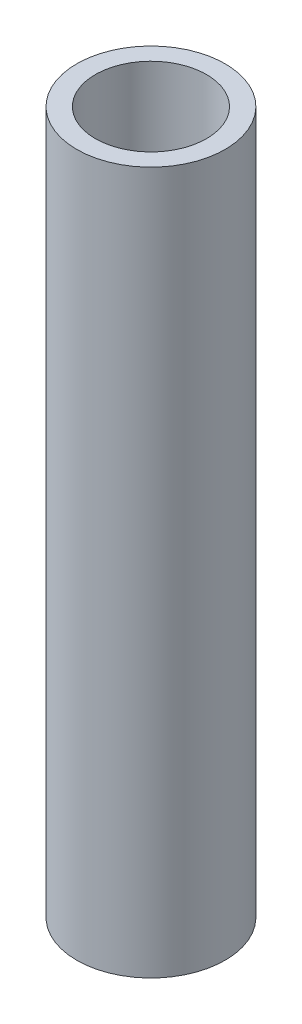
ISO-10303-21;
HEADER;
FILE_DESCRIPTION(('STEP AP214'),'2;1');
FILE_NAME('part.step','',(''),(''),'','','');
FILE_SCHEMA(('AUTOMOTIVE_DESIGN { 1 0 10303 214 1 1 1 1 }'));
ENDSEC;
DATA;
#1=APPLICATION_CONTEXT('core data for automotive mechanical design processes');
#2=APPLICATION_PROTOCOL_DEFINITION('international standard','automotive_design',2000,#1);
#3=PRODUCT_CONTEXT('',#1,'mechanical');
#4=PRODUCT('Part','Part','',(#3));
#5=PRODUCT_RELATED_PRODUCT_CATEGORY('part','',(#4));
#6=PRODUCT_DEFINITION_FORMATION('','',#4);
#7=PRODUCT_DEFINITION_CONTEXT('part definition',#1,'design');
#8=PRODUCT_DEFINITION('design','',#6,#7);
#9=PRODUCT_DEFINITION_SHAPE('','',#8);
#10=(LENGTH_UNIT() NAMED_UNIT(*) SI_UNIT(.MILLI.,.METRE.));
#11=(NAMED_UNIT(*) PLANE_ANGLE_UNIT() SI_UNIT($,.RADIAN.));
#12=(NAMED_UNIT(*) SI_UNIT($,.STERADIAN.) SOLID_ANGLE_UNIT());
#13=UNCERTAINTY_MEASURE_WITH_UNIT(LENGTH_MEASURE(1.E-05),#10,'distance_accuracy_value','');
#14=(GEOMETRIC_REPRESENTATION_CONTEXT(3) GLOBAL_UNCERTAINTY_ASSIGNED_CONTEXT((#13)) GLOBAL_UNIT_ASSIGNED_CONTEXT((#10,
#11,#12)) REPRESENTATION_CONTEXT('',''));
#15=CARTESIAN_POINT('',(0.,0.,0.));
#16=DIRECTION('',(0.,0.,1.));
#17=DIRECTION('',(1.,0.,0.));
#18=AXIS2_PLACEMENT_3D('',#15,#16,#17);
#19=CARTESIAN_POINT('',(0.,60.325,0.));
#20=DIRECTION('',(0.,1.,0.));
#21=DIRECTION('',(0.,0.,1.));
#22=AXIS2_PLACEMENT_3D('',#19,#20,#21);
#23=PLANE('',#22);
#24=CARTESIAN_POINT('',(0.,60.325,0.));
#25=DIRECTION('',(0.,1.,0.));
#26=DIRECTION('',(0.,0.,1.));
#27=AXIS2_PLACEMENT_3D('',#24,#25,#26);
#28=CIRCLE('',#27,6.3754);
#29=CARTESIAN_POINT('',(0.,60.325,6.3754));
#30=VERTEX_POINT('',#29);
#31=EDGE_CURVE('E10',#30,#30,#28,.T.);
#32=ORIENTED_EDGE('',*,*,#31,.T.);
#33=EDGE_LOOP('',(#32));
#34=FACE_BOUND('',#33,.T.);
#35=CARTESIAN_POINT('',(0.,60.325,0.));
#36=DIRECTION('',(0.,1.,0.));
#37=DIRECTION('',(0.,0.,1.));
#38=AXIS2_PLACEMENT_3D('',#35,#36,#37);
#39=CIRCLE('',#38,4.7752);
#40=CARTESIAN_POINT('',(0.,60.325,4.7752));
#41=VERTEX_POINT('',#40);
#42=EDGE_CURVE('E43',#41,#41,#39,.T.);
#43=ORIENTED_EDGE('',*,*,#42,.F.);
#44=EDGE_LOOP('',(#43));
#45=FACE_BOUND('',#44,.T.);
#46=ADVANCED_FACE('F32',(#34,#45),#23,.T.);
#47=CARTESIAN_POINT('',(0.,0.,0.));
#48=DIRECTION('',(0.,1.,0.));
#49=DIRECTION('',(0.,0.,1.));
#50=AXIS2_PLACEMENT_3D('',#47,#48,#49);
#51=PLANE('',#50);
#52=CARTESIAN_POINT('',(0.,0.,0.));
#53=DIRECTION('',(0.,1.,0.));
#54=DIRECTION('',(0.,0.,1.));
#55=AXIS2_PLACEMENT_3D('',#52,#53,#54);
#56=CIRCLE('',#55,6.3754);
#57=CARTESIAN_POINT('',(0.,0.,6.3754));
#58=VERTEX_POINT('',#57);
#59=EDGE_CURVE('E36',#58,#58,#56,.T.);
#60=ORIENTED_EDGE('',*,*,#59,.F.);
#61=EDGE_LOOP('',(#60));
#62=FACE_BOUND('',#61,.T.);
#63=CARTESIAN_POINT('',(0.,0.,0.));
#64=DIRECTION('',(0.,1.,0.));
#65=DIRECTION('',(0.,0.,1.));
#66=AXIS2_PLACEMENT_3D('',#63,#64,#65);
#67=CIRCLE('',#66,4.7752);
#68=CARTESIAN_POINT('',(0.,0.,4.7752));
#69=VERTEX_POINT('',#68);
#70=EDGE_CURVE('E45',#69,#69,#67,.T.);
#71=ORIENTED_EDGE('',*,*,#70,.T.);
#72=EDGE_LOOP('',(#71));
#73=FACE_BOUND('',#72,.T.);
#74=ADVANCED_FACE('F55',(#62,#73),#51,.F.);
#75=CARTESIAN_POINT('',(0.,60.325,0.));
#76=DIRECTION('',(0.,-1.,0.));
#77=DIRECTION('',(0.,0.,-1.));
#78=AXIS2_PLACEMENT_3D('',#75,#76,#77);
#79=CYLINDRICAL_SURFACE('',#78,6.3754);
#80=ORIENTED_EDGE('',*,*,#31,.F.);
#81=EDGE_LOOP('',(#80));
#82=FACE_BOUND('',#81,.T.);
#83=ORIENTED_EDGE('',*,*,#59,.T.);
#84=EDGE_LOOP('',(#83));
#85=FACE_BOUND('',#84,.T.);
#86=ADVANCED_FACE('F34',(#82,#85),#79,.T.);
#87=CARTESIAN_POINT('',(0.,60.325,0.));
#88=DIRECTION('',(0.,-1.,0.));
#89=DIRECTION('',(0.,0.,-1.));
#90=AXIS2_PLACEMENT_3D('',#87,#88,#89);
#91=CYLINDRICAL_SURFACE('',#90,4.7752);
#92=ORIENTED_EDGE('',*,*,#42,.T.);
#93=EDGE_LOOP('',(#92));
#94=FACE_BOUND('',#93,.T.);
#95=ORIENTED_EDGE('',*,*,#70,.F.);
#96=EDGE_LOOP('',(#95));
#97=FACE_BOUND('',#96,.T.);
#98=ADVANCED_FACE('F51',(#94,#97),#91,.F.);
#99=CLOSED_SHELL('',(#46,#74,#86,#98));
#100=MANIFOLD_SOLID_BREP('B2',#99);
#101=ADVANCED_BREP_SHAPE_REPRESENTATION('',(#18,#100),#14);
#102=SHAPE_DEFINITION_REPRESENTATION(#9,#101);
ENDSEC;
END-ISO-10303-21;
